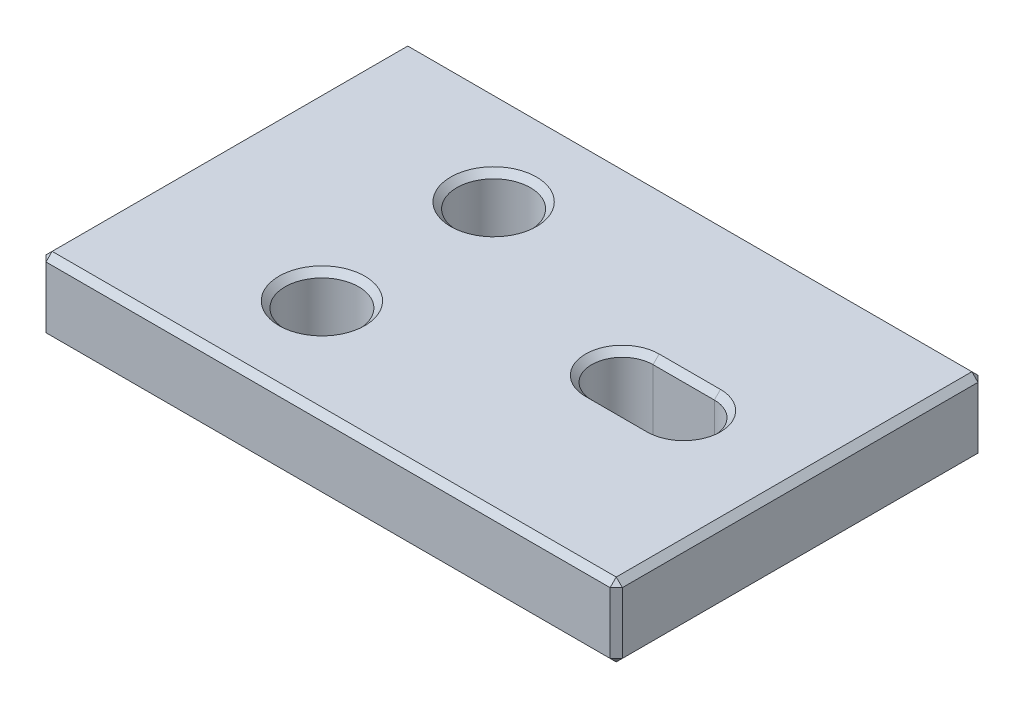
ISO-10303-21;
HEADER;
FILE_DESCRIPTION(('STEP AP214'),'2;1');
FILE_NAME('part.step','',(''),(''),'','','');
FILE_SCHEMA(('AUTOMOTIVE_DESIGN { 1 0 10303 214 1 1 1 1 }'));
ENDSEC;
DATA;
#1=APPLICATION_CONTEXT('core data for automotive mechanical design processes');
#2=APPLICATION_PROTOCOL_DEFINITION('international standard','automotive_design',2000,#1);
#3=PRODUCT_CONTEXT('',#1,'mechanical');
#4=PRODUCT('Part','Part','',(#3));
#5=PRODUCT_RELATED_PRODUCT_CATEGORY('part','',(#4));
#6=PRODUCT_DEFINITION_FORMATION('','',#4);
#7=PRODUCT_DEFINITION_CONTEXT('part definition',#1,'design');
#8=PRODUCT_DEFINITION('design','',#6,#7);
#9=PRODUCT_DEFINITION_SHAPE('','',#8);
#10=(LENGTH_UNIT() NAMED_UNIT(*) SI_UNIT(.MILLI.,.METRE.));
#11=(NAMED_UNIT(*) PLANE_ANGLE_UNIT() SI_UNIT($,.RADIAN.));
#12=(NAMED_UNIT(*) SI_UNIT($,.STERADIAN.) SOLID_ANGLE_UNIT());
#13=UNCERTAINTY_MEASURE_WITH_UNIT(LENGTH_MEASURE(1.E-05),#10,'distance_accuracy_value','');
#14=(GEOMETRIC_REPRESENTATION_CONTEXT(3) GLOBAL_UNCERTAINTY_ASSIGNED_CONTEXT((#13)) GLOBAL_UNIT_ASSIGNED_CONTEXT((#10,
#11,#12)) REPRESENTATION_CONTEXT('',''));
#15=CARTESIAN_POINT('',(0.,0.,0.));
#16=DIRECTION('',(0.,0.,1.));
#17=DIRECTION('',(1.,0.,0.));
#18=AXIS2_PLACEMENT_3D('',#15,#16,#17);
#19=CARTESIAN_POINT('',(0.,6.,0.));
#20=DIRECTION('',(0.,1.,0.));
#21=DIRECTION('',(0.,0.,1.));
#22=AXIS2_PLACEMENT_3D('',#19,#20,#21);
#23=PLANE('',#22);
#24=CARTESIAN_POINT('',(7.77168630764119,6.,15.2214611872146));
#25=DIRECTION('',(0.,1.,0.));
#26=DIRECTION('',(0.,0.,1.));
#27=AXIS2_PLACEMENT_3D('',#24,#25,#26);
#28=CIRCLE('',#27,3.5);
#29=CARTESIAN_POINT('',(7.77168630764119,6.,18.7214611872146));
#30=VERTEX_POINT('',#29);
#31=EDGE_CURVE('E410',#30,#30,#28,.F.);
#32=ORIENTED_EDGE('',*,*,#31,.T.);
#33=EDGE_LOOP('',(#32));
#34=FACE_BOUND('',#33,.T.);
#35=DIRECTION('',(-1.,0.,0.));
#36=VECTOR('',#35,1.);
#37=CARTESIAN_POINT('',(0.,6.,11.2214611872146));
#38=LINE('',#37,#36);
#39=CARTESIAN_POINT('',(30.2716863076412,6.,11.2214611872146));
#40=VERTEX_POINT('',#39);
#41=CARTESIAN_POINT('',(25.2716863076412,6.,11.2214611872146));
#42=VERTEX_POINT('',#41);
#43=EDGE_CURVE('E405',#40,#42,#38,.T.);
#44=ORIENTED_EDGE('',*,*,#43,.T.);
#45=CARTESIAN_POINT('',(25.2716863076412,6.,8.2214611872146));
#46=DIRECTION('',(0.,1.,0.));
#47=DIRECTION('',(0.,0.,1.));
#48=AXIS2_PLACEMENT_3D('',#45,#46,#47);
#49=CIRCLE('',#48,3.);
#50=CARTESIAN_POINT('',(25.2716863076412,6.,5.22146118721461));
#51=VERTEX_POINT('',#50);
#52=EDGE_CURVE('E407',#42,#51,#49,.F.);
#53=ORIENTED_EDGE('',*,*,#52,.T.);
#54=DIRECTION('',(1.,0.,0.));
#55=VECTOR('',#54,1.);
#56=CARTESIAN_POINT('',(0.,6.,5.22146118721461));
#57=LINE('',#56,#55);
#58=CARTESIAN_POINT('',(30.2716863076412,6.,5.22146118721461));
#59=VERTEX_POINT('',#58);
#60=EDGE_CURVE('E401',#51,#59,#57,.T.);
#61=ORIENTED_EDGE('',*,*,#60,.T.);
#62=CARTESIAN_POINT('',(30.2716863076412,6.,8.2214611872146));
#63=DIRECTION('',(0.,1.,0.));
#64=DIRECTION('',(0.,0.,1.));
#65=AXIS2_PLACEMENT_3D('',#62,#63,#64);
#66=CIRCLE('',#65,3.);
#67=EDGE_CURVE('E403',#59,#40,#66,.F.);
#68=ORIENTED_EDGE('',*,*,#67,.T.);
#69=EDGE_LOOP('',(#44,#53,#61,#68));
#70=FACE_BOUND('',#69,.T.);
#71=DIRECTION('',(0.,0.,-1.));
#72=VECTOR('',#71,1.);
#73=CARTESIAN_POINT('',(39.2716863076412,6.,-6.7785388127854));
#74=LINE('',#73,#72);
#75=CARTESIAN_POINT('',(39.2716863076412,6.,22.7214611872146));
#76=VERTEX_POINT('',#75);
#77=CARTESIAN_POINT('',(39.2716863076412,6.,-6.27853881278539));
#78=VERTEX_POINT('',#77);
#79=EDGE_CURVE('E396',#76,#78,#74,.T.);
#80=ORIENTED_EDGE('',*,*,#79,.T.);
#81=DIRECTION('',(-1.,0.,0.));
#82=VECTOR('',#81,1.);
#83=CARTESIAN_POINT('',(-7.2283136923588,6.,-6.27853881278539));
#84=LINE('',#83,#82);
#85=CARTESIAN_POINT('',(-6.72831369235879,6.,-6.27853881278539));
#86=VERTEX_POINT('',#85);
#87=EDGE_CURVE('E398',#78,#86,#84,.T.);
#88=ORIENTED_EDGE('',*,*,#87,.T.);
#89=DIRECTION('',(0.,0.,1.));
#90=VECTOR('',#89,1.);
#91=CARTESIAN_POINT('',(-6.72831369235879,6.,23.2214611872146));
#92=LINE('',#91,#90);
#93=CARTESIAN_POINT('',(-6.72831369235879,6.,22.7214611872146));
#94=VERTEX_POINT('',#93);
#95=EDGE_CURVE('E392',#86,#94,#92,.T.);
#96=ORIENTED_EDGE('',*,*,#95,.T.);
#97=DIRECTION('',(1.,0.,0.));
#98=VECTOR('',#97,1.);
#99=CARTESIAN_POINT('',(39.7716863076412,6.,22.7214611872146));
#100=LINE('',#99,#98);
#101=EDGE_CURVE('E394',#94,#76,#100,.T.);
#102=ORIENTED_EDGE('',*,*,#101,.T.);
#103=EDGE_LOOP('',(#80,#88,#96,#102));
#104=FACE_BOUND('',#103,.T.);
#105=CARTESIAN_POINT('',(7.7716863076412,6.,1.22146118721461));
#106=DIRECTION('',(0.,1.,0.));
#107=DIRECTION('',(0.,0.,1.));
#108=AXIS2_PLACEMENT_3D('',#105,#106,#107);
#109=CIRCLE('',#108,3.5);
#110=CARTESIAN_POINT('',(7.7716863076412,6.,4.72146118721461));
#111=VERTEX_POINT('',#110);
#112=EDGE_CURVE('E389',#111,#111,#109,.F.);
#113=ORIENTED_EDGE('',*,*,#112,.T.);
#114=EDGE_LOOP('',(#113));
#115=FACE_BOUND('',#114,.T.);
#116=ADVANCED_FACE('F33',(#34,#70,#104,#115),#23,.T.);
#117=CARTESIAN_POINT('',(0.,0.,0.));
#118=DIRECTION('',(0.,1.,0.));
#119=DIRECTION('',(0.,0.,1.));
#120=AXIS2_PLACEMENT_3D('',#117,#118,#119);
#121=PLANE('',#120);
#122=CARTESIAN_POINT('',(7.77168630764119,0.,15.2214611872146));
#123=DIRECTION('',(0.,1.,0.));
#124=DIRECTION('',(0.,0.,1.));
#125=AXIS2_PLACEMENT_3D('',#122,#123,#124);
#126=CIRCLE('',#125,3.5);
#127=CARTESIAN_POINT('',(7.77168630764119,0.,18.7214611872146));
#128=VERTEX_POINT('',#127);
#129=EDGE_CURVE('E357',#128,#128,#126,.T.);
#130=ORIENTED_EDGE('',*,*,#129,.T.);
#131=EDGE_LOOP('',(#130));
#132=FACE_BOUND('',#131,.T.);
#133=CARTESIAN_POINT('',(25.2716863076412,0.,8.2214611872146));
#134=DIRECTION('',(0.,1.,0.));
#135=DIRECTION('',(0.,0.,1.));
#136=AXIS2_PLACEMENT_3D('',#133,#134,#135);
#137=CIRCLE('',#136,3.);
#138=CARTESIAN_POINT('',(25.2716863076412,0.,5.22146118721461));
#139=VERTEX_POINT('',#138);
#140=CARTESIAN_POINT('',(25.2716863076412,0.,11.2214611872146));
#141=VERTEX_POINT('',#140);
#142=EDGE_CURVE('E352',#139,#141,#137,.T.);
#143=ORIENTED_EDGE('',*,*,#142,.T.);
#144=DIRECTION('',(1.,0.,0.));
#145=VECTOR('',#144,1.);
#146=CARTESIAN_POINT('',(30.2716863076412,0.,11.2214611872146));
#147=LINE('',#146,#145);
#148=CARTESIAN_POINT('',(30.2716863076412,0.,11.2214611872146));
#149=VERTEX_POINT('',#148);
#150=EDGE_CURVE('E354',#141,#149,#147,.T.);
#151=ORIENTED_EDGE('',*,*,#150,.T.);
#152=CARTESIAN_POINT('',(30.2716863076412,0.,8.2214611872146));
#153=DIRECTION('',(0.,1.,0.));
#154=DIRECTION('',(0.,0.,1.));
#155=AXIS2_PLACEMENT_3D('',#152,#153,#154);
#156=CIRCLE('',#155,3.);
#157=CARTESIAN_POINT('',(30.2716863076412,0.,5.22146118721461));
#158=VERTEX_POINT('',#157);
#159=EDGE_CURVE('E348',#149,#158,#156,.T.);
#160=ORIENTED_EDGE('',*,*,#159,.T.);
#161=DIRECTION('',(-1.,0.,0.));
#162=VECTOR('',#161,1.);
#163=CARTESIAN_POINT('',(25.2716863076412,0.,5.22146118721461));
#164=LINE('',#163,#162);
#165=EDGE_CURVE('E350',#158,#139,#164,.T.);
#166=ORIENTED_EDGE('',*,*,#165,.T.);
#167=EDGE_LOOP('',(#143,#151,#160,#166));
#168=FACE_BOUND('',#167,.T.);
#169=CARTESIAN_POINT('',(7.7716863076412,0.,1.22146118721461));
#170=DIRECTION('',(0.,1.,0.));
#171=DIRECTION('',(0.,0.,1.));
#172=AXIS2_PLACEMENT_3D('',#169,#170,#171);
#173=CIRCLE('',#172,3.5);
#174=CARTESIAN_POINT('',(7.7716863076412,0.,4.72146118721461));
#175=VERTEX_POINT('',#174);
#176=EDGE_CURVE('E345',#175,#175,#173,.T.);
#177=ORIENTED_EDGE('',*,*,#176,.T.);
#178=EDGE_LOOP('',(#177));
#179=FACE_BOUND('',#178,.T.);
#180=DIRECTION('',(0.,0.,1.));
#181=VECTOR('',#180,1.);
#182=CARTESIAN_POINT('',(39.2716863076412,0.,0.));
#183=LINE('',#182,#181);
#184=CARTESIAN_POINT('',(39.2716863076412,0.,-6.27853881278539));
#185=VERTEX_POINT('',#184);
#186=CARTESIAN_POINT('',(39.2716863076412,0.,22.7214611872146));
#187=VERTEX_POINT('',#186);
#188=EDGE_CURVE('E180',#185,#187,#183,.T.);
#189=ORIENTED_EDGE('',*,*,#188,.T.);
#190=DIRECTION('',(-1.,0.,0.));
#191=VECTOR('',#190,1.);
#192=CARTESIAN_POINT('',(0.,0.,22.7214611872146));
#193=LINE('',#192,#191);
#194=CARTESIAN_POINT('',(-6.72831369235879,0.,22.7214611872146));
#195=VERTEX_POINT('',#194);
#196=EDGE_CURVE('E175',#187,#195,#193,.T.);
#197=ORIENTED_EDGE('',*,*,#196,.T.);
#198=DIRECTION('',(0.,0.,-1.));
#199=VECTOR('',#198,1.);
#200=CARTESIAN_POINT('',(-6.72831369235879,0.,0.));
#201=LINE('',#200,#199);
#202=CARTESIAN_POINT('',(-6.72831369235879,0.,-6.27853881278539));
#203=VERTEX_POINT('',#202);
#204=EDGE_CURVE('E169',#195,#203,#201,.T.);
#205=ORIENTED_EDGE('',*,*,#204,.T.);
#206=DIRECTION('',(1.,0.,0.));
#207=VECTOR('',#206,1.);
#208=CARTESIAN_POINT('',(0.,0.,-6.27853881278539));
#209=LINE('',#208,#207);
#210=EDGE_CURVE('E172',#203,#185,#209,.T.);
#211=ORIENTED_EDGE('',*,*,#210,.T.);
#212=EDGE_LOOP('',(#189,#197,#205,#211));
#213=FACE_BOUND('',#212,.T.);
#214=ADVANCED_FACE('F171',(#132,#168,#179,#213),#121,.F.);
#215=CARTESIAN_POINT('',(-7.2283136923588,6.,-6.7785388127854));
#216=DIRECTION('',(1.,0.,0.));
#217=DIRECTION('',(0.,0.,-1.));
#218=AXIS2_PLACEMENT_3D('',#215,#216,#217);
#219=PLANE('',#218);
#220=DIRECTION('',(0.,-1.,0.));
#221=VECTOR('',#220,1.);
#222=CARTESIAN_POINT('',(-7.2283136923588,6.,-6.27853881278539));
#223=LINE('',#222,#221);
#224=CARTESIAN_POINT('',(-7.2283136923588,5.49999999999999,-6.27853881278539));
#225=VERTEX_POINT('',#224);
#226=CARTESIAN_POINT('',(-7.2283136923588,0.500000000000007,-6.27853881278539));
#227=VERTEX_POINT('',#226);
#228=EDGE_CURVE('E289',#225,#227,#223,.T.);
#229=ORIENTED_EDGE('',*,*,#228,.T.);
#230=DIRECTION('',(0.,0.,1.));
#231=VECTOR('',#230,1.);
#232=CARTESIAN_POINT('',(-7.2283136923588,0.500000000000007,-6.7785388127854));
#233=LINE('',#232,#231);
#234=CARTESIAN_POINT('',(-7.2283136923588,0.500000000000007,22.7214611872146));
#235=VERTEX_POINT('',#234);
#236=EDGE_CURVE('E198',#227,#235,#233,.T.);
#237=ORIENTED_EDGE('',*,*,#236,.T.);
#238=DIRECTION('',(0.,1.,0.));
#239=VECTOR('',#238,1.);
#240=CARTESIAN_POINT('',(-7.2283136923588,6.,22.7214611872146));
#241=LINE('',#240,#239);
#242=CARTESIAN_POINT('',(-7.2283136923588,5.49999999999999,22.7214611872146));
#243=VERTEX_POINT('',#242);
#244=EDGE_CURVE('E415',#235,#243,#241,.T.);
#245=ORIENTED_EDGE('',*,*,#244,.T.);
#246=DIRECTION('',(0.,0.,-1.));
#247=VECTOR('',#246,1.);
#248=CARTESIAN_POINT('',(-7.2283136923588,5.49999999999999,-6.7785388127854));
#249=LINE('',#248,#247);
#250=EDGE_CURVE('E413',#243,#225,#249,.T.);
#251=ORIENTED_EDGE('',*,*,#250,.T.);
#252=EDGE_LOOP('',(#229,#237,#245,#251));
#253=FACE_BOUND('',#252,.T.);
#254=ADVANCED_FACE('F446',(#253),#219,.F.);
#255=CARTESIAN_POINT('',(-7.2283136923588,6.,23.2214611872146));
#256=DIRECTION('',(0.,0.,-1.));
#257=DIRECTION('',(-1.,0.,0.));
#258=AXIS2_PLACEMENT_3D('',#255,#256,#257);
#259=PLANE('',#258);
#260=DIRECTION('',(0.,-1.,0.));
#261=VECTOR('',#260,1.);
#262=CARTESIAN_POINT('',(-6.72831369235879,6.,23.2214611872146));
#263=LINE('',#262,#261);
#264=CARTESIAN_POINT('',(-6.72831369235879,5.49999999999999,23.2214611872146));
#265=VERTEX_POINT('',#264);
#266=CARTESIAN_POINT('',(-6.72831369235879,0.500000000000007,23.2214611872146));
#267=VERTEX_POINT('',#266);
#268=EDGE_CURVE('E304',#265,#267,#263,.T.);
#269=ORIENTED_EDGE('',*,*,#268,.T.);
#270=DIRECTION('',(1.,0.,0.));
#271=VECTOR('',#270,1.);
#272=CARTESIAN_POINT('',(-7.2283136923588,0.500000000000007,23.2214611872146));
#273=LINE('',#272,#271);
#274=CARTESIAN_POINT('',(39.2716863076412,0.500000000000007,23.2214611872146));
#275=VERTEX_POINT('',#274);
#276=EDGE_CURVE('E307',#267,#275,#273,.T.);
#277=ORIENTED_EDGE('',*,*,#276,.T.);
#278=DIRECTION('',(0.,1.,0.));
#279=VECTOR('',#278,1.);
#280=CARTESIAN_POINT('',(39.2716863076412,6.,23.2214611872146));
#281=LINE('',#280,#279);
#282=CARTESIAN_POINT('',(39.2716863076412,5.49999999999999,23.2214611872146));
#283=VERTEX_POINT('',#282);
#284=EDGE_CURVE('E297',#275,#283,#281,.T.);
#285=ORIENTED_EDGE('',*,*,#284,.T.);
#286=DIRECTION('',(-1.,0.,0.));
#287=VECTOR('',#286,1.);
#288=CARTESIAN_POINT('',(-7.2283136923588,5.49999999999999,23.2214611872146));
#289=LINE('',#288,#287);
#290=EDGE_CURVE('E294',#283,#265,#289,.T.);
#291=ORIENTED_EDGE('',*,*,#290,.T.);
#292=EDGE_LOOP('',(#269,#277,#285,#291));
#293=FACE_BOUND('',#292,.T.);
#294=ADVANCED_FACE('F472',(#293),#259,.F.);
#295=CARTESIAN_POINT('',(39.7716863076412,6.,-6.7785388127854));
#296=DIRECTION('',(-1.,0.,0.));
#297=DIRECTION('',(0.,0.,1.));
#298=AXIS2_PLACEMENT_3D('',#295,#296,#297);
#299=PLANE('',#298);
#300=DIRECTION('',(0.,0.,1.));
#301=VECTOR('',#300,1.);
#302=CARTESIAN_POINT('',(39.7716863076412,5.49999999999999,23.2214611872146));
#303=LINE('',#302,#301);
#304=CARTESIAN_POINT('',(39.7716863076412,5.49999999999999,-6.27853881278539));
#305=VERTEX_POINT('',#304);
#306=CARTESIAN_POINT('',(39.7716863076412,5.49999999999999,22.7214611872146));
#307=VERTEX_POINT('',#306);
#308=EDGE_CURVE('E309',#305,#307,#303,.T.);
#309=ORIENTED_EDGE('',*,*,#308,.T.);
#310=DIRECTION('',(0.,-1.,0.));
#311=VECTOR('',#310,1.);
#312=CARTESIAN_POINT('',(39.7716863076412,6.,22.7214611872146));
#313=LINE('',#312,#311);
#314=CARTESIAN_POINT('',(39.7716863076412,0.500000000000007,22.7214611872146));
#315=VERTEX_POINT('',#314);
#316=EDGE_CURVE('E11',#307,#315,#313,.T.);
#317=ORIENTED_EDGE('',*,*,#316,.T.);
#318=DIRECTION('',(0.,0.,-1.));
#319=VECTOR('',#318,1.);
#320=CARTESIAN_POINT('',(39.7716863076412,0.500000000000007,-6.7785388127854));
#321=LINE('',#320,#319);
#322=CARTESIAN_POINT('',(39.7716863076412,0.500000000000007,-6.27853881278539));
#323=VERTEX_POINT('',#322);
#324=EDGE_CURVE('E42',#315,#323,#321,.T.);
#325=ORIENTED_EDGE('',*,*,#324,.T.);
#326=DIRECTION('',(0.,1.,0.));
#327=VECTOR('',#326,1.);
#328=CARTESIAN_POINT('',(39.7716863076412,6.,-6.27853881278539));
#329=LINE('',#328,#327);
#330=EDGE_CURVE('E311',#323,#305,#329,.T.);
#331=ORIENTED_EDGE('',*,*,#330,.T.);
#332=EDGE_LOOP('',(#309,#317,#325,#331));
#333=FACE_BOUND('',#332,.T.);
#334=ADVANCED_FACE('F467',(#333),#299,.F.);
#335=CARTESIAN_POINT('',(-7.2283136923588,6.,-6.7785388127854));
#336=DIRECTION('',(0.,0.,1.));
#337=DIRECTION('',(1.,0.,0.));
#338=AXIS2_PLACEMENT_3D('',#335,#336,#337);
#339=PLANE('',#338);
#340=DIRECTION('',(-1.,0.,0.));
#341=VECTOR('',#340,1.);
#342=CARTESIAN_POINT('',(-7.2283136923588,0.500000000000007,-6.7785388127854));
#343=LINE('',#342,#341);
#344=CARTESIAN_POINT('',(39.2716863076412,0.500000000000007,-6.7785388127854));
#345=VERTEX_POINT('',#344);
#346=CARTESIAN_POINT('',(-6.72831369235879,0.500000000000007,-6.7785388127854));
#347=VERTEX_POINT('',#346);
#348=EDGE_CURVE('E295',#345,#347,#343,.T.);
#349=ORIENTED_EDGE('',*,*,#348,.T.);
#350=DIRECTION('',(0.,1.,0.));
#351=VECTOR('',#350,1.);
#352=CARTESIAN_POINT('',(-6.72831369235879,6.,-6.7785388127854));
#353=LINE('',#352,#351);
#354=CARTESIAN_POINT('',(-6.72831369235879,5.49999999999999,-6.7785388127854));
#355=VERTEX_POINT('',#354);
#356=EDGE_CURVE('E291',#347,#355,#353,.T.);
#357=ORIENTED_EDGE('',*,*,#356,.T.);
#358=DIRECTION('',(1.,0.,0.));
#359=VECTOR('',#358,1.);
#360=CARTESIAN_POINT('',(39.7716863076412,5.49999999999999,-6.7785388127854));
#361=LINE('',#360,#359);
#362=CARTESIAN_POINT('',(39.2716863076412,5.49999999999999,-6.7785388127854));
#363=VERTEX_POINT('',#362);
#364=EDGE_CURVE('E419',#355,#363,#361,.T.);
#365=ORIENTED_EDGE('',*,*,#364,.T.);
#366=DIRECTION('',(0.,-1.,0.));
#367=VECTOR('',#366,1.);
#368=CARTESIAN_POINT('',(39.2716863076412,6.,-6.7785388127854));
#369=LINE('',#368,#367);
#370=EDGE_CURVE('E299',#363,#345,#369,.T.);
#371=ORIENTED_EDGE('',*,*,#370,.T.);
#372=EDGE_LOOP('',(#349,#357,#365,#371));
#373=FACE_BOUND('',#372,.T.);
#374=ADVANCED_FACE('F422',(#373),#339,.F.);
#375=CARTESIAN_POINT('',(30.2716863076412,6.,8.2214611872146));
#376=DIRECTION('',(0.,-1.,0.));
#377=DIRECTION('',(0.,0.,-1.));
#378=AXIS2_PLACEMENT_3D('',#375,#376,#377);
#379=CYLINDRICAL_SURFACE('',#378,2.5);
#380=DIRECTION('',(0.,-1.,0.));
#381=VECTOR('',#380,1.);
#382=CARTESIAN_POINT('',(30.2716863076412,6.,5.72146118721461));
#383=LINE('',#382,#381);
#384=CARTESIAN_POINT('',(30.2716863076412,5.5,5.72146118721461));
#385=VERTEX_POINT('',#384);
#386=CARTESIAN_POINT('',(30.2716863076412,0.499999999999994,5.72146118721461));
#387=VERTEX_POINT('',#386);
#388=EDGE_CURVE('E192',#385,#387,#383,.T.);
#389=ORIENTED_EDGE('',*,*,#388,.T.);
#390=CARTESIAN_POINT('',(30.2716863076412,0.499999999999994,8.2214611872146));
#391=DIRECTION('',(0.,1.,0.));
#392=DIRECTION('',(0.,0.,1.));
#393=AXIS2_PLACEMENT_3D('',#390,#391,#392);
#394=CIRCLE('',#393,2.5);
#395=CARTESIAN_POINT('',(30.2716863076412,0.499999999999994,10.7214611872146));
#396=VERTEX_POINT('',#395);
#397=EDGE_CURVE('E381',#387,#396,#394,.F.);
#398=ORIENTED_EDGE('',*,*,#397,.T.);
#399=DIRECTION('',(0.,-1.,0.));
#400=VECTOR('',#399,1.);
#401=CARTESIAN_POINT('',(30.2716863076412,6.,10.7214611872146));
#402=LINE('',#401,#400);
#403=CARTESIAN_POINT('',(30.2716863076412,5.5,10.7214611872146));
#404=VERTEX_POINT('',#403);
#405=EDGE_CURVE('E323',#404,#396,#402,.T.);
#406=ORIENTED_EDGE('',*,*,#405,.F.);
#407=CARTESIAN_POINT('',(30.2716863076412,5.5,8.2214611872146));
#408=DIRECTION('',(0.,1.,0.));
#409=DIRECTION('',(0.,0.,1.));
#410=AXIS2_PLACEMENT_3D('',#407,#408,#409);
#411=CIRCLE('',#410,2.5);
#412=EDGE_CURVE('E379',#404,#385,#411,.T.);
#413=ORIENTED_EDGE('',*,*,#412,.T.);
#414=EDGE_LOOP('',(#389,#398,#406,#413));
#415=FACE_BOUND('',#414,.T.);
#416=ADVANCED_FACE('F497',(#415),#379,.F.);
#417=CARTESIAN_POINT('',(30.2716863076412,6.,5.72146118721461));
#418=DIRECTION('',(0.,0.,1.));
#419=DIRECTION('',(1.,0.,0.));
#420=AXIS2_PLACEMENT_3D('',#417,#418,#419);
#421=PLANE('',#420);
#422=DIRECTION('',(0.,-1.,0.));
#423=VECTOR('',#422,1.);
#424=CARTESIAN_POINT('',(25.2716863076412,6.,5.72146118721461));
#425=LINE('',#424,#423);
#426=CARTESIAN_POINT('',(25.2716863076412,5.5,5.72146118721461));
#427=VERTEX_POINT('',#426);
#428=CARTESIAN_POINT('',(25.2716863076412,0.499999999999994,5.72146118721461));
#429=VERTEX_POINT('',#428);
#430=EDGE_CURVE('E336',#427,#429,#425,.T.);
#431=ORIENTED_EDGE('',*,*,#430,.T.);
#432=DIRECTION('',(1.,0.,0.));
#433=VECTOR('',#432,1.);
#434=CARTESIAN_POINT('',(30.2716863076412,0.499999999999994,5.72146118721461));
#435=LINE('',#434,#433);
#436=EDGE_CURVE('E377',#429,#387,#435,.T.);
#437=ORIENTED_EDGE('',*,*,#436,.T.);
#438=ORIENTED_EDGE('',*,*,#388,.F.);
#439=DIRECTION('',(-1.,0.,0.));
#440=VECTOR('',#439,1.);
#441=CARTESIAN_POINT('',(30.2716863076412,5.5,5.72146118721461));
#442=LINE('',#441,#440);
#443=EDGE_CURVE('E375',#385,#427,#442,.T.);
#444=ORIENTED_EDGE('',*,*,#443,.T.);
#445=EDGE_LOOP('',(#431,#437,#438,#444));
#446=FACE_BOUND('',#445,.T.);
#447=ADVANCED_FACE('F786',(#446),#421,.T.);
#448=CARTESIAN_POINT('',(25.2716863076412,6.,8.2214611872146));
#449=DIRECTION('',(0.,-1.,0.));
#450=DIRECTION('',(0.,0.,-1.));
#451=AXIS2_PLACEMENT_3D('',#448,#449,#450);
#452=CYLINDRICAL_SURFACE('',#451,2.5);
#453=DIRECTION('',(0.,-1.,0.));
#454=VECTOR('',#453,1.);
#455=CARTESIAN_POINT('',(25.2716863076412,6.,10.7214611872146));
#456=LINE('',#455,#454);
#457=CARTESIAN_POINT('',(25.2716863076412,5.5,10.7214611872146));
#458=VERTEX_POINT('',#457);
#459=CARTESIAN_POINT('',(25.2716863076412,0.499999999999994,10.7214611872146));
#460=VERTEX_POINT('',#459);
#461=EDGE_CURVE('E329',#458,#460,#456,.T.);
#462=ORIENTED_EDGE('',*,*,#461,.T.);
#463=CARTESIAN_POINT('',(25.2716863076412,0.499999999999994,8.2214611872146));
#464=DIRECTION('',(0.,1.,0.));
#465=DIRECTION('',(0.,0.,1.));
#466=AXIS2_PLACEMENT_3D('',#463,#464,#465);
#467=CIRCLE('',#466,2.5);
#468=EDGE_CURVE('E373',#460,#429,#467,.F.);
#469=ORIENTED_EDGE('',*,*,#468,.T.);
#470=ORIENTED_EDGE('',*,*,#430,.F.);
#471=CARTESIAN_POINT('',(25.2716863076412,5.5,8.2214611872146));
#472=DIRECTION('',(0.,1.,0.));
#473=DIRECTION('',(0.,0.,1.));
#474=AXIS2_PLACEMENT_3D('',#471,#472,#473);
#475=CIRCLE('',#474,2.5);
#476=EDGE_CURVE('E370',#427,#458,#475,.T.);
#477=ORIENTED_EDGE('',*,*,#476,.T.);
#478=EDGE_LOOP('',(#462,#469,#470,#477));
#479=FACE_BOUND('',#478,.T.);
#480=ADVANCED_FACE('F778',(#479),#452,.F.);
#481=CARTESIAN_POINT('',(30.2716863076412,6.,10.7214611872146));
#482=DIRECTION('',(0.,0.,-1.));
#483=DIRECTION('',(-1.,0.,0.));
#484=AXIS2_PLACEMENT_3D('',#481,#482,#483);
#485=PLANE('',#484);
#486=ORIENTED_EDGE('',*,*,#405,.T.);
#487=DIRECTION('',(-1.,0.,0.));
#488=VECTOR('',#487,1.);
#489=CARTESIAN_POINT('',(25.2716863076412,0.499999999999994,10.7214611872146));
#490=LINE('',#489,#488);
#491=EDGE_CURVE('E368',#396,#460,#490,.T.);
#492=ORIENTED_EDGE('',*,*,#491,.T.);
#493=ORIENTED_EDGE('',*,*,#461,.F.);
#494=DIRECTION('',(1.,0.,0.));
#495=VECTOR('',#494,1.);
#496=CARTESIAN_POINT('',(30.2716863076412,5.5,10.7214611872146));
#497=LINE('',#496,#495);
#498=EDGE_CURVE('E366',#458,#404,#497,.T.);
#499=ORIENTED_EDGE('',*,*,#498,.T.);
#500=EDGE_LOOP('',(#486,#492,#493,#499));
#501=FACE_BOUND('',#500,.T.);
#502=ADVANCED_FACE('F769',(#501),#485,.T.);
#503=CARTESIAN_POINT('',(7.7716863076412,6.,1.22146118721461));
#504=DIRECTION('',(0.,-1.,0.));
#505=DIRECTION('',(0.,0.,-1.));
#506=AXIS2_PLACEMENT_3D('',#503,#504,#505);
#507=CYLINDRICAL_SURFACE('',#506,2.99999999999999);
#508=CARTESIAN_POINT('',(7.7716863076412,0.500000000000006,1.22146118721461));
#509=DIRECTION('',(0.,1.,0.));
#510=DIRECTION('',(0.,0.,1.));
#511=AXIS2_PLACEMENT_3D('',#508,#509,#510);
#512=CIRCLE('',#511,2.99999999999999);
#513=CARTESIAN_POINT('',(7.7716863076412,0.500000000000006,4.2214611872146));
#514=VERTEX_POINT('',#513);
#515=EDGE_CURVE('E386',#514,#514,#512,.F.);
#516=ORIENTED_EDGE('',*,*,#515,.T.);
#517=EDGE_LOOP('',(#516));
#518=FACE_BOUND('',#517,.T.);
#519=CARTESIAN_POINT('',(7.7716863076412,5.49999999999999,1.22146118721461));
#520=DIRECTION('',(0.,1.,0.));
#521=DIRECTION('',(0.,0.,1.));
#522=AXIS2_PLACEMENT_3D('',#519,#520,#521);
#523=CIRCLE('',#522,2.99999999999999);
#524=CARTESIAN_POINT('',(7.7716863076412,5.49999999999999,4.2214611872146));
#525=VERTEX_POINT('',#524);
#526=EDGE_CURVE('E383',#525,#525,#523,.T.);
#527=ORIENTED_EDGE('',*,*,#526,.T.);
#528=EDGE_LOOP('',(#527));
#529=FACE_BOUND('',#528,.T.);
#530=ADVANCED_FACE('F760',(#518,#529),#507,.F.);
#531=CARTESIAN_POINT('',(7.77168630764119,6.,15.2214611872146));
#532=DIRECTION('',(0.,-1.,0.));
#533=DIRECTION('',(0.,0.,-1.));
#534=AXIS2_PLACEMENT_3D('',#531,#532,#533);
#535=CYLINDRICAL_SURFACE('',#534,2.99999999999999);
#536=CARTESIAN_POINT('',(7.77168630764119,0.500000000000006,15.2214611872146));
#537=DIRECTION('',(0.,1.,0.));
#538=DIRECTION('',(0.,0.,1.));
#539=AXIS2_PLACEMENT_3D('',#536,#537,#538);
#540=CIRCLE('',#539,2.99999999999999);
#541=CARTESIAN_POINT('',(7.77168630764119,0.500000000000006,18.2214611872146));
#542=VERTEX_POINT('',#541);
#543=EDGE_CURVE('E363',#542,#542,#540,.F.);
#544=ORIENTED_EDGE('',*,*,#543,.T.);
#545=EDGE_LOOP('',(#544));
#546=FACE_BOUND('',#545,.T.);
#547=CARTESIAN_POINT('',(7.77168630764119,5.49999999999999,15.2214611872146));
#548=DIRECTION('',(0.,1.,0.));
#549=DIRECTION('',(0.,0.,1.));
#550=AXIS2_PLACEMENT_3D('',#547,#548,#549);
#551=CIRCLE('',#550,2.99999999999999);
#552=CARTESIAN_POINT('',(7.77168630764119,5.49999999999999,18.2214611872146));
#553=VERTEX_POINT('',#552);
#554=EDGE_CURVE('E360',#553,#553,#551,.T.);
#555=ORIENTED_EDGE('',*,*,#554,.T.);
#556=EDGE_LOOP('',(#555));
#557=FACE_BOUND('',#556,.T.);
#558=ADVANCED_FACE('F512',(#546,#557),#535,.F.);
#559=CARTESIAN_POINT('',(7.77168630764119,0.,15.2214611872146));
#560=DIRECTION('',(0.,-1.,0.));
#561=DIRECTION('',(0.,0.,-1.));
#562=AXIS2_PLACEMENT_3D('',#559,#560,#561);
#563=CONICAL_SURFACE('',#562,3.5,0.785398163397452);
#564=ORIENTED_EDGE('',*,*,#543,.F.);
#565=EDGE_LOOP('',(#564));
#566=FACE_BOUND('',#565,.T.);
#567=ORIENTED_EDGE('',*,*,#129,.F.);
#568=EDGE_LOOP('',(#567));
#569=FACE_BOUND('',#568,.T.);
#570=ADVANCED_FACE('F508',(#566,#569),#563,.F.);
#571=CARTESIAN_POINT('',(0.,0.,5.22146118721461));
#572=DIRECTION('',(0.,-0.707106781186552,0.707106781186543));
#573=DIRECTION('',(1.,0.,0.));
#574=AXIS2_PLACEMENT_3D('',#571,#572,#573);
#575=PLANE('',#574);
#576=DIRECTION('',(0.,-0.707106781186543,-0.707106781186552));
#577=VECTOR('',#576,1.);
#578=CARTESIAN_POINT('',(30.2716863076412,0.499999999999994,5.72146118721461));
#579=LINE('',#578,#577);
#580=EDGE_CURVE('E316',#387,#158,#579,.T.);
#581=ORIENTED_EDGE('',*,*,#580,.F.);
#582=ORIENTED_EDGE('',*,*,#436,.F.);
#583=DIRECTION('',(0.,0.707106781186543,0.707106781186552));
#584=VECTOR('',#583,1.);
#585=CARTESIAN_POINT('',(25.2716863076412,0.,5.22146118721461));
#586=LINE('',#585,#584);
#587=EDGE_CURVE('E278',#139,#429,#586,.T.);
#588=ORIENTED_EDGE('',*,*,#587,.F.);
#589=ORIENTED_EDGE('',*,*,#165,.F.);
#590=EDGE_LOOP('',(#581,#582,#588,#589));
#591=FACE_BOUND('',#590,.T.);
#592=ADVANCED_FACE('F511',(#591),#575,.T.);
#593=CARTESIAN_POINT('',(25.2716863076412,0.,8.2214611872146));
#594=DIRECTION('',(0.,-1.,0.));
#595=DIRECTION('',(0.,0.,-1.));
#596=AXIS2_PLACEMENT_3D('',#593,#594,#595);
#597=CONICAL_SURFACE('',#596,3.,0.785398163397456);
#598=ORIENTED_EDGE('',*,*,#587,.T.);
#599=ORIENTED_EDGE('',*,*,#468,.F.);
#600=DIRECTION('',(0.,0.707106781186543,-0.707106781186552));
#601=VECTOR('',#600,1.);
#602=CARTESIAN_POINT('',(25.2716863076412,0.,11.2214611872146));
#603=LINE('',#602,#601);
#604=EDGE_CURVE('E315',#141,#460,#603,.T.);
#605=ORIENTED_EDGE('',*,*,#604,.F.);
#606=ORIENTED_EDGE('',*,*,#142,.F.);
#607=EDGE_LOOP('',(#598,#599,#605,#606));
#608=FACE_BOUND('',#607,.T.);
#609=ADVANCED_FACE('F522',(#608),#597,.F.);
#610=CARTESIAN_POINT('',(30.2716863076412,0.,8.2214611872146));
#611=DIRECTION('',(0.,-1.,0.));
#612=DIRECTION('',(0.,0.,-1.));
#613=AXIS2_PLACEMENT_3D('',#610,#611,#612);
#614=CONICAL_SURFACE('',#613,3.,0.785398163397455);
#615=ORIENTED_EDGE('',*,*,#580,.T.);
#616=ORIENTED_EDGE('',*,*,#159,.F.);
#617=DIRECTION('',(0.,-0.707106781186543,0.707106781186552));
#618=VECTOR('',#617,1.);
#619=CARTESIAN_POINT('',(30.2716863076412,0.499999999999994,10.7214611872146));
#620=LINE('',#619,#618);
#621=EDGE_CURVE('E285',#396,#149,#620,.T.);
#622=ORIENTED_EDGE('',*,*,#621,.F.);
#623=ORIENTED_EDGE('',*,*,#397,.F.);
#624=EDGE_LOOP('',(#615,#616,#622,#623));
#625=FACE_BOUND('',#624,.T.);
#626=ADVANCED_FACE('F518',(#625),#614,.F.);
#627=CARTESIAN_POINT('',(0.,0.,11.2214611872146));
#628=DIRECTION('',(0.,-0.707106781186552,-0.707106781186543));
#629=DIRECTION('',(-1.,0.,0.));
#630=AXIS2_PLACEMENT_3D('',#627,#628,#629);
#631=PLANE('',#630);
#632=ORIENTED_EDGE('',*,*,#604,.T.);
#633=ORIENTED_EDGE('',*,*,#491,.F.);
#634=ORIENTED_EDGE('',*,*,#621,.T.);
#635=ORIENTED_EDGE('',*,*,#150,.F.);
#636=EDGE_LOOP('',(#632,#633,#634,#635));
#637=FACE_BOUND('',#636,.T.);
#638=ADVANCED_FACE('F514',(#637),#631,.T.);
#639=CARTESIAN_POINT('',(7.7716863076412,0.,1.22146118721461));
#640=DIRECTION('',(0.,-1.,0.));
#641=DIRECTION('',(0.,0.,-1.));
#642=AXIS2_PLACEMENT_3D('',#639,#640,#641);
#643=CONICAL_SURFACE('',#642,3.5,0.785398163397451);
#644=ORIENTED_EDGE('',*,*,#515,.F.);
#645=EDGE_LOOP('',(#644));
#646=FACE_BOUND('',#645,.T.);
#647=ORIENTED_EDGE('',*,*,#176,.F.);
#648=EDGE_LOOP('',(#647));
#649=FACE_BOUND('',#648,.T.);
#650=ADVANCED_FACE('F517',(#646,#649),#643,.F.);
#651=CARTESIAN_POINT('',(7.77168630764119,5.49999999999999,15.2214611872146));
#652=DIRECTION('',(0.,1.,0.));
#653=DIRECTION('',(0.,0.,1.));
#654=AXIS2_PLACEMENT_3D('',#651,#652,#653);
#655=CONICAL_SURFACE('',#654,2.99999999999999,0.785398163397452);
#656=ORIENTED_EDGE('',*,*,#31,.F.);
#657=EDGE_LOOP('',(#656));
#658=FACE_BOUND('',#657,.T.);
#659=ORIENTED_EDGE('',*,*,#554,.F.);
#660=EDGE_LOOP('',(#659));
#661=FACE_BOUND('',#660,.T.);
#662=ADVANCED_FACE('F530',(#658,#661),#655,.F.);
#663=CARTESIAN_POINT('',(30.2716863076412,5.5,8.2214611872146));
#664=DIRECTION('',(0.,1.,0.));
#665=DIRECTION('',(0.,0.,1.));
#666=AXIS2_PLACEMENT_3D('',#663,#664,#665);
#667=CONICAL_SURFACE('',#666,2.5,0.785398163397448);
#668=DIRECTION('',(0.,-0.707106781186547,-0.707106781186547));
#669=VECTOR('',#668,1.);
#670=CARTESIAN_POINT('',(30.2716863076412,6.,11.2214611872146));
#671=LINE('',#670,#669);
#672=EDGE_CURVE('E275',#40,#404,#671,.T.);
#673=ORIENTED_EDGE('',*,*,#672,.F.);
#674=ORIENTED_EDGE('',*,*,#67,.F.);
#675=DIRECTION('',(0.,0.707106781186547,-0.707106781186547));
#676=VECTOR('',#675,1.);
#677=CARTESIAN_POINT('',(30.2716863076412,5.5,5.72146118721461));
#678=LINE('',#677,#676);
#679=EDGE_CURVE('E283',#385,#59,#678,.T.);
#680=ORIENTED_EDGE('',*,*,#679,.F.);
#681=ORIENTED_EDGE('',*,*,#412,.F.);
#682=EDGE_LOOP('',(#673,#674,#680,#681));
#683=FACE_BOUND('',#682,.T.);
#684=ADVANCED_FACE('F534',(#683),#667,.F.);
#685=CARTESIAN_POINT('',(30.2716863076412,5.5,5.72146118721461));
#686=DIRECTION('',(0.,-0.707106781186547,-0.707106781186547));
#687=DIRECTION('',(-1.,0.,0.));
#688=AXIS2_PLACEMENT_3D('',#685,#686,#687);
#689=PLANE('',#688);
#690=ORIENTED_EDGE('',*,*,#679,.T.);
#691=ORIENTED_EDGE('',*,*,#60,.F.);
#692=DIRECTION('',(0.,0.707106781186547,-0.707106781186547));
#693=VECTOR('',#692,1.);
#694=CARTESIAN_POINT('',(25.2716863076412,5.5,5.72146118721461));
#695=LINE('',#694,#693);
#696=EDGE_CURVE('E268',#427,#51,#695,.T.);
#697=ORIENTED_EDGE('',*,*,#696,.F.);
#698=ORIENTED_EDGE('',*,*,#443,.F.);
#699=EDGE_LOOP('',(#690,#691,#697,#698));
#700=FACE_BOUND('',#699,.T.);
#701=ADVANCED_FACE('F542',(#700),#689,.F.);
#702=CARTESIAN_POINT('',(30.2716863076412,5.5,10.7214611872146));
#703=DIRECTION('',(0.,-0.707106781186547,0.707106781186547));
#704=DIRECTION('',(1.,0.,0.));
#705=AXIS2_PLACEMENT_3D('',#702,#703,#704);
#706=PLANE('',#705);
#707=ORIENTED_EDGE('',*,*,#672,.T.);
#708=ORIENTED_EDGE('',*,*,#498,.F.);
#709=DIRECTION('',(0.,-0.707106781186547,-0.707106781186547));
#710=VECTOR('',#709,1.);
#711=CARTESIAN_POINT('',(25.2716863076412,6.,11.2214611872146));
#712=LINE('',#711,#710);
#713=EDGE_CURVE('E263',#42,#458,#712,.T.);
#714=ORIENTED_EDGE('',*,*,#713,.F.);
#715=ORIENTED_EDGE('',*,*,#43,.F.);
#716=EDGE_LOOP('',(#707,#708,#714,#715));
#717=FACE_BOUND('',#716,.T.);
#718=ADVANCED_FACE('F539',(#717),#706,.F.);
#719=CARTESIAN_POINT('',(25.2716863076412,5.5,8.2214611872146));
#720=DIRECTION('',(0.,1.,0.));
#721=DIRECTION('',(0.,0.,1.));
#722=AXIS2_PLACEMENT_3D('',#719,#720,#721);
#723=CONICAL_SURFACE('',#722,2.5,0.785398163397449);
#724=ORIENTED_EDGE('',*,*,#696,.T.);
#725=ORIENTED_EDGE('',*,*,#52,.F.);
#726=ORIENTED_EDGE('',*,*,#713,.T.);
#727=ORIENTED_EDGE('',*,*,#476,.F.);
#728=EDGE_LOOP('',(#724,#725,#726,#727));
#729=FACE_BOUND('',#728,.T.);
#730=ADVANCED_FACE('F536',(#729),#723,.F.);
#731=CARTESIAN_POINT('',(39.7716863076412,6.,22.7214611872146));
#732=DIRECTION('',(-0.707106781186547,0.,-0.707106781186547));
#733=DIRECTION('',(0.,-1.,0.));
#734=AXIS2_PLACEMENT_3D('',#731,#732,#733);
#735=PLANE('',#734);
#736=DIRECTION('',(-0.707106781186547,0.,0.707106781186547));
#737=VECTOR('',#736,1.);
#738=CARTESIAN_POINT('',(39.2716863076412,5.49999999999999,23.2214611872146));
#739=LINE('',#738,#737);
#740=EDGE_CURVE('E37',#283,#307,#739,.F.);
#741=ORIENTED_EDGE('',*,*,#740,.F.);
#742=ORIENTED_EDGE('',*,*,#284,.F.);
#743=DIRECTION('',(0.707106781186547,0.,-0.707106781186547));
#744=VECTOR('',#743,1.);
#745=CARTESIAN_POINT('',(39.7716863076412,0.500000000000007,22.7214611872146));
#746=LINE('',#745,#744);
#747=EDGE_CURVE('E257',#315,#275,#746,.F.);
#748=ORIENTED_EDGE('',*,*,#747,.F.);
#749=ORIENTED_EDGE('',*,*,#316,.F.);
#750=EDGE_LOOP('',(#741,#742,#748,#749));
#751=FACE_BOUND('',#750,.T.);
#752=ADVANCED_FACE('F469',(#751),#735,.F.);
#753=CARTESIAN_POINT('',(39.2716863076412,5.49999999999999,23.2214611872146));
#754=DIRECTION('',(0.577350269189626,0.577350269189626,0.577350269189626));
#755=DIRECTION('',(0.707106781186547,0.,-0.707106781186547));
#756=AXIS2_PLACEMENT_3D('',#753,#754,#755);
#757=PLANE('',#756);
#758=DIRECTION('',(0.,-0.707106781186547,0.707106781186547));
#759=VECTOR('',#758,1.);
#760=CARTESIAN_POINT('',(39.2716863076412,5.49999999999999,23.2214611872146));
#761=LINE('',#760,#759);
#762=EDGE_CURVE('E252',#283,#76,#761,.F.);
#763=ORIENTED_EDGE('',*,*,#762,.F.);
#764=ORIENTED_EDGE('',*,*,#740,.T.);
#765=DIRECTION('',(-0.707106781186547,0.707106781186547,0.));
#766=VECTOR('',#765,1.);
#767=CARTESIAN_POINT('',(39.5216863076412,5.75,22.7214611872146));
#768=LINE('',#767,#766);
#769=EDGE_CURVE('E255',#76,#307,#768,.F.);
#770=ORIENTED_EDGE('',*,*,#769,.F.);
#771=EDGE_LOOP('',(#763,#764,#770));
#772=FACE_BOUND('',#771,.T.);
#773=ADVANCED_FACE('F684',(#772),#757,.T.);
#774=CARTESIAN_POINT('',(39.7716863076412,0.500000000000007,22.7214611872146));
#775=DIRECTION('',(0.577350269189626,-0.577350269189626,0.577350269189626));
#776=DIRECTION('',(0.707106781186547,0.,-0.707106781186547));
#777=AXIS2_PLACEMENT_3D('',#774,#775,#776);
#778=PLANE('',#777);
#779=DIRECTION('',(-0.707106781186547,-0.707106781186547,0.));
#780=VECTOR('',#779,1.);
#781=CARTESIAN_POINT('',(39.7716863076412,0.500000000000007,22.7214611872146));
#782=LINE('',#781,#780);
#783=EDGE_CURVE('E247',#315,#187,#782,.T.);
#784=ORIENTED_EDGE('',*,*,#783,.F.);
#785=ORIENTED_EDGE('',*,*,#747,.T.);
#786=DIRECTION('',(0.,0.707106781186547,0.707106781186547));
#787=VECTOR('',#786,1.);
#788=CARTESIAN_POINT('',(39.2716863076412,0.250000000000004,22.9714611872146));
#789=LINE('',#788,#787);
#790=EDGE_CURVE('E249',#187,#275,#789,.T.);
#791=ORIENTED_EDGE('',*,*,#790,.F.);
#792=EDGE_LOOP('',(#784,#785,#791));
#793=FACE_BOUND('',#792,.T.);
#794=ADVANCED_FACE('F430',(#793),#778,.T.);
#795=CARTESIAN_POINT('',(39.2716863076412,6.,0.));
#796=DIRECTION('',(0.707106781186547,0.707106781186547,0.));
#797=DIRECTION('',(0.,0.,1.));
#798=AXIS2_PLACEMENT_3D('',#795,#796,#797);
#799=PLANE('',#798);
#800=ORIENTED_EDGE('',*,*,#769,.T.);
#801=ORIENTED_EDGE('',*,*,#308,.F.);
#802=DIRECTION('',(0.707106781186547,-0.707106781186547,0.));
#803=VECTOR('',#802,1.);
#804=CARTESIAN_POINT('',(39.7716863076412,5.49999999999999,-6.27853881278539));
#805=LINE('',#804,#803);
#806=EDGE_CURVE('E241',#78,#305,#805,.T.);
#807=ORIENTED_EDGE('',*,*,#806,.F.);
#808=ORIENTED_EDGE('',*,*,#79,.F.);
#809=EDGE_LOOP('',(#800,#801,#807,#808));
#810=FACE_BOUND('',#809,.T.);
#811=ADVANCED_FACE('F465',(#810),#799,.T.);
#812=CARTESIAN_POINT('',(0.,6.,22.7214611872146));
#813=DIRECTION('',(0.,0.707106781186547,0.707106781186547));
#814=DIRECTION('',(-1.,0.,0.));
#815=AXIS2_PLACEMENT_3D('',#812,#813,#814);
#816=PLANE('',#815);
#817=ORIENTED_EDGE('',*,*,#762,.T.);
#818=ORIENTED_EDGE('',*,*,#101,.F.);
#819=DIRECTION('',(0.,0.707106781186547,-0.707106781186547));
#820=VECTOR('',#819,1.);
#821=CARTESIAN_POINT('',(-6.72831369235879,5.75,22.9714611872146));
#822=LINE('',#821,#820);
#823=EDGE_CURVE('E238',#265,#94,#822,.T.);
#824=ORIENTED_EDGE('',*,*,#823,.F.);
#825=ORIENTED_EDGE('',*,*,#290,.F.);
#826=EDGE_LOOP('',(#817,#818,#824,#825));
#827=FACE_BOUND('',#826,.T.);
#828=ADVANCED_FACE('F475',(#827),#816,.T.);
#829=CARTESIAN_POINT('',(-6.72831369235879,6.,23.2214611872146));
#830=DIRECTION('',(0.707106781186547,0.,-0.707106781186547));
#831=DIRECTION('',(0.,-1.,0.));
#832=AXIS2_PLACEMENT_3D('',#829,#830,#831);
#833=PLANE('',#832);
#834=DIRECTION('',(0.707106781186547,0.,0.707106781186547));
#835=VECTOR('',#834,1.);
#836=CARTESIAN_POINT('',(-6.72831369235879,0.500000000000007,23.2214611872146));
#837=LINE('',#836,#835);
#838=EDGE_CURVE('E232',#267,#235,#837,.F.);
#839=ORIENTED_EDGE('',*,*,#838,.F.);
#840=ORIENTED_EDGE('',*,*,#268,.F.);
#841=DIRECTION('',(-0.707106781186547,0.,-0.707106781186547));
#842=VECTOR('',#841,1.);
#843=CARTESIAN_POINT('',(-7.2283136923588,5.49999999999999,22.7214611872146));
#844=LINE('',#843,#842);
#845=EDGE_CURVE('E235',#243,#265,#844,.F.);
#846=ORIENTED_EDGE('',*,*,#845,.F.);
#847=ORIENTED_EDGE('',*,*,#244,.F.);
#848=EDGE_LOOP('',(#839,#840,#846,#847));
#849=FACE_BOUND('',#848,.T.);
#850=ADVANCED_FACE('F441',(#849),#833,.F.);
#851=CARTESIAN_POINT('',(-7.2283136923588,0.500000000000007,23.2214611872146));
#852=DIRECTION('',(0.,0.707106781186547,-0.707106781186547));
#853=DIRECTION('',(1.,0.,0.));
#854=AXIS2_PLACEMENT_3D('',#851,#852,#853);
#855=PLANE('',#854);
#856=ORIENTED_EDGE('',*,*,#790,.T.);
#857=ORIENTED_EDGE('',*,*,#276,.F.);
#858=DIRECTION('',(0.,-0.707106781186547,-0.707106781186547));
#859=VECTOR('',#858,1.);
#860=CARTESIAN_POINT('',(-6.72831369235879,0.500000000000007,23.2214611872146));
#861=LINE('',#860,#859);
#862=EDGE_CURVE('E230',#195,#267,#861,.F.);
#863=ORIENTED_EDGE('',*,*,#862,.F.);
#864=ORIENTED_EDGE('',*,*,#196,.F.);
#865=EDGE_LOOP('',(#856,#857,#863,#864));
#866=FACE_BOUND('',#865,.T.);
#867=ADVANCED_FACE('F434',(#866),#855,.F.);
#868=CARTESIAN_POINT('',(39.7716863076412,0.500000000000007,-6.7785388127854));
#869=DIRECTION('',(-0.707106781186547,0.707106781186547,0.));
#870=DIRECTION('',(0.,0.,-1.));
#871=AXIS2_PLACEMENT_3D('',#868,#869,#870);
#872=PLANE('',#871);
#873=ORIENTED_EDGE('',*,*,#783,.T.);
#874=ORIENTED_EDGE('',*,*,#188,.F.);
#875=DIRECTION('',(0.707106781186547,0.707106781186547,0.));
#876=VECTOR('',#875,1.);
#877=CARTESIAN_POINT('',(39.7716863076412,0.500000000000007,-6.27853881278539));
#878=LINE('',#877,#876);
#879=EDGE_CURVE('E227',#323,#185,#878,.F.);
#880=ORIENTED_EDGE('',*,*,#879,.F.);
#881=ORIENTED_EDGE('',*,*,#324,.F.);
#882=EDGE_LOOP('',(#873,#874,#880,#881));
#883=FACE_BOUND('',#882,.T.);
#884=ADVANCED_FACE('F429',(#883),#872,.F.);
#885=CARTESIAN_POINT('',(39.2716863076412,6.,-6.7785388127854));
#886=DIRECTION('',(-0.707106781186547,0.,0.707106781186547));
#887=DIRECTION('',(0.,-1.,0.));
#888=AXIS2_PLACEMENT_3D('',#885,#886,#887);
#889=PLANE('',#888);
#890=DIRECTION('',(0.707106781186547,0.,0.707106781186547));
#891=VECTOR('',#890,1.);
#892=CARTESIAN_POINT('',(39.7716863076412,5.49999999999999,-6.27853881278539));
#893=LINE('',#892,#891);
#894=EDGE_CURVE('E244',#305,#363,#893,.F.);
#895=ORIENTED_EDGE('',*,*,#894,.F.);
#896=ORIENTED_EDGE('',*,*,#330,.F.);
#897=DIRECTION('',(-0.707106781186547,0.,-0.707106781186547));
#898=VECTOR('',#897,1.);
#899=CARTESIAN_POINT('',(39.7716863076412,0.500000000000007,-6.27853881278539));
#900=LINE('',#899,#898);
#901=EDGE_CURVE('E224',#345,#323,#900,.F.);
#902=ORIENTED_EDGE('',*,*,#901,.F.);
#903=ORIENTED_EDGE('',*,*,#370,.F.);
#904=EDGE_LOOP('',(#895,#896,#902,#903));
#905=FACE_BOUND('',#904,.T.);
#906=ADVANCED_FACE('F426',(#905),#889,.F.);
#907=CARTESIAN_POINT('',(39.7716863076412,5.49999999999999,-6.27853881278539));
#908=DIRECTION('',(0.577350269189626,0.577350269189626,-0.577350269189626));
#909=DIRECTION('',(-0.707106781186547,0.,-0.707106781186547));
#910=AXIS2_PLACEMENT_3D('',#907,#908,#909);
#911=PLANE('',#910);
#912=ORIENTED_EDGE('',*,*,#806,.T.);
#913=ORIENTED_EDGE('',*,*,#894,.T.);
#914=DIRECTION('',(0.,0.707106781186547,0.707106781186547));
#915=VECTOR('',#914,1.);
#916=CARTESIAN_POINT('',(39.2716863076412,5.75,-6.52853881278539));
#917=LINE('',#916,#915);
#918=EDGE_CURVE('E221',#78,#363,#917,.F.);
#919=ORIENTED_EDGE('',*,*,#918,.F.);
#920=EDGE_LOOP('',(#912,#913,#919));
#921=FACE_BOUND('',#920,.T.);
#922=ADVANCED_FACE('F460',(#921),#911,.T.);
#923=CARTESIAN_POINT('',(-7.2283136923588,5.49999999999999,22.7214611872146));
#924=DIRECTION('',(-0.577350269189626,0.577350269189626,0.577350269189626));
#925=DIRECTION('',(0.707106781186547,0.,0.707106781186547));
#926=AXIS2_PLACEMENT_3D('',#923,#924,#925);
#927=PLANE('',#926);
#928=ORIENTED_EDGE('',*,*,#845,.T.);
#929=ORIENTED_EDGE('',*,*,#823,.T.);
#930=DIRECTION('',(-0.707106781186548,-0.707106781186547,0.));
#931=VECTOR('',#930,1.);
#932=CARTESIAN_POINT('',(-7.2283136923588,5.49999999999999,22.7214611872146));
#933=LINE('',#932,#931);
#934=EDGE_CURVE('E218',#243,#94,#933,.F.);
#935=ORIENTED_EDGE('',*,*,#934,.F.);
#936=EDGE_LOOP('',(#928,#929,#935));
#937=FACE_BOUND('',#936,.T.);
#938=ADVANCED_FACE('F478',(#937),#927,.T.);
#939=CARTESIAN_POINT('',(-6.72831369235879,0.500000000000007,23.2214611872146));
#940=DIRECTION('',(-0.577350269189626,-0.577350269189626,0.577350269189626));
#941=DIRECTION('',(0.707106781186547,0.,0.707106781186547));
#942=AXIS2_PLACEMENT_3D('',#939,#940,#941);
#943=PLANE('',#942);
#944=ORIENTED_EDGE('',*,*,#862,.T.);
#945=ORIENTED_EDGE('',*,*,#838,.T.);
#946=DIRECTION('',(-0.707106781186548,0.707106781186547,0.));
#947=VECTOR('',#946,1.);
#948=CARTESIAN_POINT('',(-6.97831369235879,0.250000000000004,22.7214611872146));
#949=LINE('',#948,#947);
#950=EDGE_CURVE('E216',#195,#235,#949,.T.);
#951=ORIENTED_EDGE('',*,*,#950,.F.);
#952=EDGE_LOOP('',(#944,#945,#951));
#953=FACE_BOUND('',#952,.T.);
#954=ADVANCED_FACE('F437',(#953),#943,.T.);
#955=CARTESIAN_POINT('',(39.7716863076412,0.500000000000007,-6.27853881278539));
#956=DIRECTION('',(0.577350269189626,-0.577350269189626,-0.577350269189626));
#957=DIRECTION('',(-0.707106781186547,0.,-0.707106781186547));
#958=AXIS2_PLACEMENT_3D('',#955,#956,#957);
#959=PLANE('',#958);
#960=ORIENTED_EDGE('',*,*,#901,.T.);
#961=ORIENTED_EDGE('',*,*,#879,.T.);
#962=DIRECTION('',(0.,-0.707106781186547,0.707106781186547));
#963=VECTOR('',#962,1.);
#964=CARTESIAN_POINT('',(39.2716863076412,0.250000000000004,-6.52853881278539));
#965=LINE('',#964,#963);
#966=EDGE_CURVE('E191',#345,#185,#965,.T.);
#967=ORIENTED_EDGE('',*,*,#966,.F.);
#968=EDGE_LOOP('',(#960,#961,#967));
#969=FACE_BOUND('',#968,.T.);
#970=ADVANCED_FACE('F428',(#969),#959,.T.);
#971=CARTESIAN_POINT('',(0.,6.,-6.27853881278539));
#972=DIRECTION('',(0.,0.707106781186547,-0.707106781186547));
#973=DIRECTION('',(1.,0.,0.));
#974=AXIS2_PLACEMENT_3D('',#971,#972,#973);
#975=PLANE('',#974);
#976=ORIENTED_EDGE('',*,*,#918,.T.);
#977=ORIENTED_EDGE('',*,*,#364,.F.);
#978=DIRECTION('',(0.,-0.707106781186547,-0.707106781186547));
#979=VECTOR('',#978,1.);
#980=CARTESIAN_POINT('',(-6.72831369235879,5.49999999999999,-6.7785388127854));
#981=LINE('',#980,#979);
#982=EDGE_CURVE('E212',#86,#355,#981,.T.);
#983=ORIENTED_EDGE('',*,*,#982,.F.);
#984=ORIENTED_EDGE('',*,*,#87,.F.);
#985=EDGE_LOOP('',(#976,#977,#983,#984));
#986=FACE_BOUND('',#985,.T.);
#987=ADVANCED_FACE('F457',(#986),#975,.T.);
#988=CARTESIAN_POINT('',(-6.72831369235879,6.,0.));
#989=DIRECTION('',(-0.707106781186547,0.707106781186548,0.));
#990=DIRECTION('',(0.,0.,-1.));
#991=AXIS2_PLACEMENT_3D('',#988,#989,#990);
#992=PLANE('',#991);
#993=ORIENTED_EDGE('',*,*,#934,.T.);
#994=ORIENTED_EDGE('',*,*,#95,.F.);
#995=DIRECTION('',(0.707106781186547,0.707106781186547,0.));
#996=VECTOR('',#995,1.);
#997=CARTESIAN_POINT('',(-6.9783136923588,5.75,-6.27853881278539));
#998=LINE('',#997,#996);
#999=EDGE_CURVE('E202',#225,#86,#998,.T.);
#1000=ORIENTED_EDGE('',*,*,#999,.F.);
#1001=ORIENTED_EDGE('',*,*,#250,.F.);
#1002=EDGE_LOOP('',(#993,#994,#1000,#1001));
#1003=FACE_BOUND('',#1002,.T.);
#1004=ADVANCED_FACE('F451',(#1003),#992,.T.);
#1005=CARTESIAN_POINT('',(-7.2283136923588,0.500000000000007,-6.7785388127854));
#1006=DIRECTION('',(0.707106781186547,0.707106781186548,0.));
#1007=DIRECTION('',(0.,0.,1.));
#1008=AXIS2_PLACEMENT_3D('',#1005,#1006,#1007);
#1009=PLANE('',#1008);
#1010=ORIENTED_EDGE('',*,*,#950,.T.);
#1011=ORIENTED_EDGE('',*,*,#236,.F.);
#1012=DIRECTION('',(0.707106781186547,-0.707106781186547,0.));
#1013=VECTOR('',#1012,1.);
#1014=CARTESIAN_POINT('',(-7.2283136923588,0.500000000000007,-6.27853881278539));
#1015=LINE('',#1014,#1013);
#1016=EDGE_CURVE('E196',#203,#227,#1015,.F.);
#1017=ORIENTED_EDGE('',*,*,#1016,.F.);
#1018=ORIENTED_EDGE('',*,*,#204,.F.);
#1019=EDGE_LOOP('',(#1010,#1011,#1017,#1018));
#1020=FACE_BOUND('',#1019,.T.);
#1021=ADVANCED_FACE('F197',(#1020),#1009,.F.);
#1022=CARTESIAN_POINT('',(-7.2283136923588,0.500000000000007,-6.7785388127854));
#1023=DIRECTION('',(0.,0.707106781186547,0.707106781186547));
#1024=DIRECTION('',(-1.,0.,0.));
#1025=AXIS2_PLACEMENT_3D('',#1022,#1023,#1024);
#1026=PLANE('',#1025);
#1027=ORIENTED_EDGE('',*,*,#966,.T.);
#1028=ORIENTED_EDGE('',*,*,#210,.F.);
#1029=DIRECTION('',(0.,0.707106781186547,-0.707106781186547));
#1030=VECTOR('',#1029,1.);
#1031=CARTESIAN_POINT('',(-6.72831369235879,0.250000000000004,-6.52853881278539));
#1032=LINE('',#1031,#1030);
#1033=EDGE_CURVE('E188',#347,#203,#1032,.F.);
#1034=ORIENTED_EDGE('',*,*,#1033,.F.);
#1035=ORIENTED_EDGE('',*,*,#348,.F.);
#1036=EDGE_LOOP('',(#1027,#1028,#1034,#1035));
#1037=FACE_BOUND('',#1036,.T.);
#1038=ADVANCED_FACE('F185',(#1037),#1026,.F.);
#1039=CARTESIAN_POINT('',(-6.72831369235879,5.49999999999999,-6.7785388127854));
#1040=DIRECTION('',(-0.577350269189626,0.577350269189626,-0.577350269189626));
#1041=DIRECTION('',(-0.707106781186547,0.,0.707106781186547));
#1042=AXIS2_PLACEMENT_3D('',#1039,#1040,#1041);
#1043=PLANE('',#1042);
#1044=ORIENTED_EDGE('',*,*,#999,.T.);
#1045=ORIENTED_EDGE('',*,*,#982,.T.);
#1046=DIRECTION('',(0.707106781186547,0.,-0.707106781186547));
#1047=VECTOR('',#1046,1.);
#1048=CARTESIAN_POINT('',(-6.72831369235879,5.49999999999999,-6.7785388127854));
#1049=LINE('',#1048,#1047);
#1050=EDGE_CURVE('E206',#225,#355,#1049,.T.);
#1051=ORIENTED_EDGE('',*,*,#1050,.F.);
#1052=EDGE_LOOP('',(#1044,#1045,#1051));
#1053=FACE_BOUND('',#1052,.T.);
#1054=ADVANCED_FACE('F454',(#1053),#1043,.T.);
#1055=CARTESIAN_POINT('',(-7.2283136923588,0.500000000000007,-6.27853881278539));
#1056=DIRECTION('',(-0.577350269189626,-0.577350269189626,-0.577350269189626));
#1057=DIRECTION('',(-0.707106781186547,0.,0.707106781186547));
#1058=AXIS2_PLACEMENT_3D('',#1055,#1056,#1057);
#1059=PLANE('',#1058);
#1060=ORIENTED_EDGE('',*,*,#1033,.T.);
#1061=ORIENTED_EDGE('',*,*,#1016,.T.);
#1062=DIRECTION('',(-0.707106781186547,0.,0.707106781186547));
#1063=VECTOR('',#1062,1.);
#1064=CARTESIAN_POINT('',(-7.2283136923588,0.500000000000007,-6.27853881278539));
#1065=LINE('',#1064,#1063);
#1066=EDGE_CURVE('E205',#347,#227,#1065,.T.);
#1067=ORIENTED_EDGE('',*,*,#1066,.F.);
#1068=EDGE_LOOP('',(#1060,#1061,#1067));
#1069=FACE_BOUND('',#1068,.T.);
#1070=ADVANCED_FACE('F204',(#1069),#1059,.T.);
#1071=CARTESIAN_POINT('',(-7.2283136923588,6.,-6.27853881278539));
#1072=DIRECTION('',(0.707106781186547,0.,0.707106781186547));
#1073=DIRECTION('',(0.,-1.,0.));
#1074=AXIS2_PLACEMENT_3D('',#1071,#1072,#1073);
#1075=PLANE('',#1074);
#1076=ORIENTED_EDGE('',*,*,#1050,.T.);
#1077=ORIENTED_EDGE('',*,*,#356,.F.);
#1078=ORIENTED_EDGE('',*,*,#1066,.T.);
#1079=ORIENTED_EDGE('',*,*,#228,.F.);
#1080=EDGE_LOOP('',(#1076,#1077,#1078,#1079));
#1081=FACE_BOUND('',#1080,.T.);
#1082=ADVANCED_FACE('F288',(#1081),#1075,.F.);
#1083=CARTESIAN_POINT('',(7.7716863076412,5.49999999999999,1.22146118721461));
#1084=DIRECTION('',(0.,1.,0.));
#1085=DIRECTION('',(0.,0.,1.));
#1086=AXIS2_PLACEMENT_3D('',#1083,#1084,#1085);
#1087=CONICAL_SURFACE('',#1086,2.99999999999999,0.785398163397452);
#1088=ORIENTED_EDGE('',*,*,#112,.F.);
#1089=EDGE_LOOP('',(#1088));
#1090=FACE_BOUND('',#1089,.T.);
#1091=ORIENTED_EDGE('',*,*,#526,.F.);
#1092=EDGE_LOOP('',(#1091));
#1093=FACE_BOUND('',#1092,.T.);
#1094=ADVANCED_FACE('F35',(#1090,#1093),#1087,.F.);
#1095=CLOSED_SHELL('',(#116,#214,#254,#294,#334,#374,#416,#447,#480,#502,#530,#558,#570,#592,
#609,#626,#638,#650,#662,#684,#701,#718,#730,#752,#773,#794,#811,#828,#850,#867,#884,#906,#922,
#938,#954,#970,#987,#1004,#1021,#1038,#1054,#1070,#1082,#1094));
#1096=MANIFOLD_SOLID_BREP('B2',#1095);
#1097=ADVANCED_BREP_SHAPE_REPRESENTATION('',(#18,#1096),#14);
#1098=SHAPE_DEFINITION_REPRESENTATION(#9,#1097);
ENDSEC;
END-ISO-10303-21;
